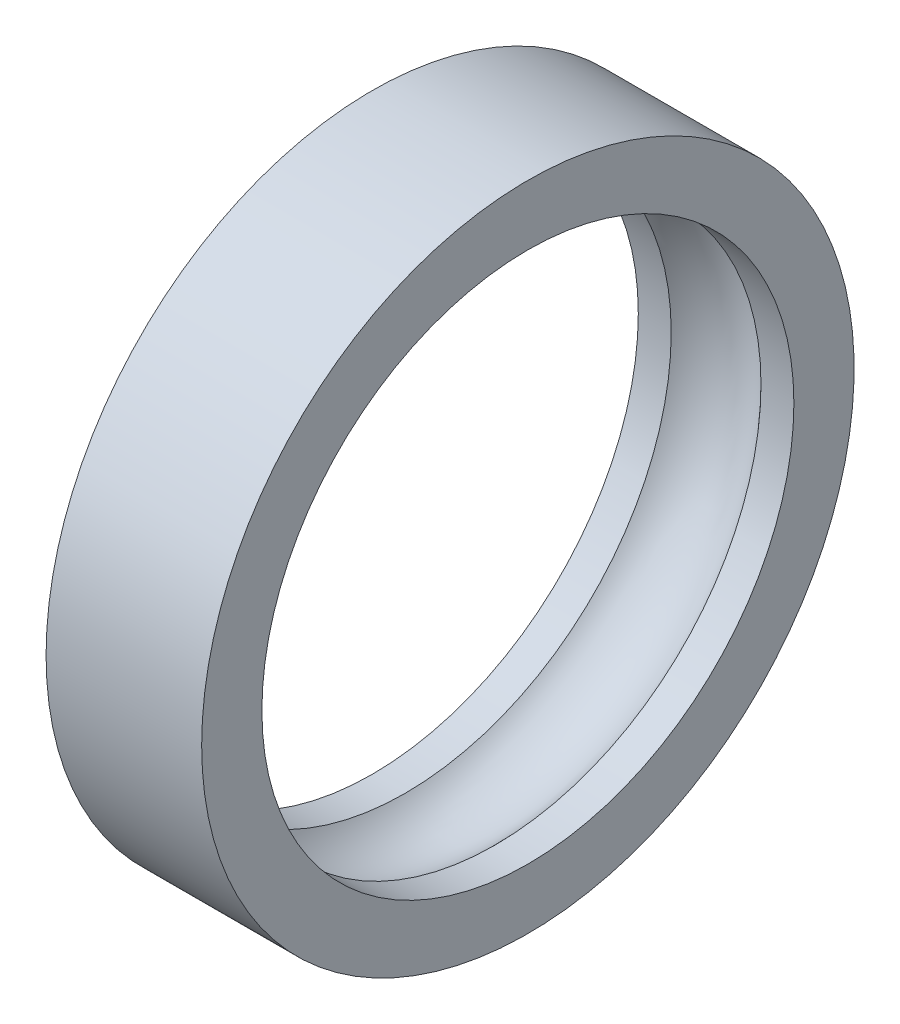
ISO-10303-21;
HEADER;
FILE_DESCRIPTION(('STEP AP214'),'2;1');
FILE_NAME('part.step','',(''),(''),'','','');
FILE_SCHEMA(('AUTOMOTIVE_DESIGN { 1 0 10303 214 1 1 1 1 }'));
ENDSEC;
DATA;
#1=APPLICATION_CONTEXT('core data for automotive mechanical design processes');
#2=APPLICATION_PROTOCOL_DEFINITION('international standard','automotive_design',2000,#1);
#3=PRODUCT_CONTEXT('',#1,'mechanical');
#4=PRODUCT('Part','Part','',(#3));
#5=PRODUCT_RELATED_PRODUCT_CATEGORY('part','',(#4));
#6=PRODUCT_DEFINITION_FORMATION('','',#4);
#7=PRODUCT_DEFINITION_CONTEXT('part definition',#1,'design');
#8=PRODUCT_DEFINITION('design','',#6,#7);
#9=PRODUCT_DEFINITION_SHAPE('','',#8);
#10=(LENGTH_UNIT() NAMED_UNIT(*) SI_UNIT(.MILLI.,.METRE.));
#11=(NAMED_UNIT(*) PLANE_ANGLE_UNIT() SI_UNIT($,.RADIAN.));
#12=(NAMED_UNIT(*) SI_UNIT($,.STERADIAN.) SOLID_ANGLE_UNIT());
#13=UNCERTAINTY_MEASURE_WITH_UNIT(LENGTH_MEASURE(1.E-05),#10,'distance_accuracy_value','');
#14=(GEOMETRIC_REPRESENTATION_CONTEXT(3) GLOBAL_UNCERTAINTY_ASSIGNED_CONTEXT((#13)) GLOBAL_UNIT_ASSIGNED_CONTEXT((#10,
#11,#12)) REPRESENTATION_CONTEXT('',''));
#15=CARTESIAN_POINT('',(0.,0.,0.));
#16=DIRECTION('',(0.,0.,1.));
#17=DIRECTION('',(1.,0.,0.));
#18=AXIS2_PLACEMENT_3D('',#15,#16,#17);
#19=CARTESIAN_POINT('',(-15.5,53.,0.));
#20=DIRECTION('',(1.,0.,0.));
#21=DIRECTION('',(0.,0.,-1.));
#22=AXIS2_PLACEMENT_3D('',#19,#20,#21);
#23=PLANE('',#22);
#24=CARTESIAN_POINT('',(-15.5,0.,0.));
#25=DIRECTION('',(-1.,0.,0.));
#26=DIRECTION('',(0.,0.,1.));
#27=AXIS2_PLACEMENT_3D('',#24,#25,#26);
#28=CIRCLE('',#27,53.);
#29=CARTESIAN_POINT('',(-15.5,0.,53.));
#30=VERTEX_POINT('',#29);
#31=EDGE_CURVE('E53',#30,#30,#28,.T.);
#32=ORIENTED_EDGE('',*,*,#31,.F.);
#33=EDGE_LOOP('',(#32));
#34=FACE_BOUND('',#33,.T.);
#35=CARTESIAN_POINT('',(-15.5,0.,0.));
#36=DIRECTION('',(-1.,0.,0.));
#37=DIRECTION('',(0.,0.,1.));
#38=AXIS2_PLACEMENT_3D('',#35,#36,#37);
#39=CIRCLE('',#38,65.);
#40=CARTESIAN_POINT('',(-15.5,0.,65.));
#41=VERTEX_POINT('',#40);
#42=EDGE_CURVE('E10',#41,#41,#39,.T.);
#43=ORIENTED_EDGE('',*,*,#42,.T.);
#44=EDGE_LOOP('',(#43));
#45=FACE_BOUND('',#44,.T.);
#46=ADVANCED_FACE('F31',(#34,#45),#23,.F.);
#47=CARTESIAN_POINT('',(-15.5,0.,0.));
#48=DIRECTION('',(-1.,0.,0.));
#49=DIRECTION('',(0.,0.,1.));
#50=AXIS2_PLACEMENT_3D('',#47,#48,#49);
#51=CYLINDRICAL_SURFACE('',#50,65.);
#52=ORIENTED_EDGE('',*,*,#42,.F.);
#53=EDGE_LOOP('',(#52));
#54=FACE_BOUND('',#53,.T.);
#55=CARTESIAN_POINT('',(15.5,0.,0.));
#56=DIRECTION('',(-1.,0.,0.));
#57=DIRECTION('',(0.,0.,1.));
#58=AXIS2_PLACEMENT_3D('',#55,#56,#57);
#59=CIRCLE('',#58,65.);
#60=CARTESIAN_POINT('',(15.5,0.,65.));
#61=VERTEX_POINT('',#60);
#62=EDGE_CURVE('E37',#61,#61,#59,.T.);
#63=ORIENTED_EDGE('',*,*,#62,.T.);
#64=EDGE_LOOP('',(#63));
#65=FACE_BOUND('',#64,.T.);
#66=ADVANCED_FACE('F60',(#54,#65),#51,.T.);
#67=CARTESIAN_POINT('',(15.5,53.,0.));
#68=DIRECTION('',(-1.,0.,0.));
#69=DIRECTION('',(0.,0.,1.));
#70=AXIS2_PLACEMENT_3D('',#67,#68,#69);
#71=PLANE('',#70);
#72=ORIENTED_EDGE('',*,*,#62,.F.);
#73=EDGE_LOOP('',(#72));
#74=FACE_BOUND('',#73,.T.);
#75=CARTESIAN_POINT('',(15.5,0.,0.));
#76=DIRECTION('',(-1.,0.,0.));
#77=DIRECTION('',(0.,0.,1.));
#78=AXIS2_PLACEMENT_3D('',#75,#76,#77);
#79=CIRCLE('',#78,53.);
#80=CARTESIAN_POINT('',(15.5,0.,53.));
#81=VERTEX_POINT('',#80);
#82=EDGE_CURVE('E41',#81,#81,#79,.T.);
#83=ORIENTED_EDGE('',*,*,#82,.T.);
#84=EDGE_LOOP('',(#83));
#85=FACE_BOUND('',#84,.T.);
#86=ADVANCED_FACE('F64',(#74,#85),#71,.F.);
#87=CARTESIAN_POINT('',(-15.5,0.,0.));
#88=DIRECTION('',(-1.,0.,0.));
#89=DIRECTION('',(0.,0.,1.));
#90=AXIS2_PLACEMENT_3D('',#87,#88,#89);
#91=CYLINDRICAL_SURFACE('',#90,53.);
#92=ORIENTED_EDGE('',*,*,#82,.F.);
#93=EDGE_LOOP('',(#92));
#94=FACE_BOUND('',#93,.T.);
#95=CARTESIAN_POINT('',(8.94427190999916,0.,0.));
#96=DIRECTION('',(-1.,0.,0.));
#97=DIRECTION('',(0.,0.,1.));
#98=AXIS2_PLACEMENT_3D('',#95,#96,#97);
#99=CIRCLE('',#98,53.);
#100=CARTESIAN_POINT('',(8.94427190999916,0.,53.));
#101=VERTEX_POINT('',#100);
#102=EDGE_CURVE('E45',#101,#101,#99,.T.);
#103=ORIENTED_EDGE('',*,*,#102,.T.);
#104=EDGE_LOOP('',(#103));
#105=FACE_BOUND('',#104,.T.);
#106=ADVANCED_FACE('F69',(#94,#105),#91,.F.);
#107=CARTESIAN_POINT('',(0.,0.,0.));
#108=DIRECTION('',(-1.,0.,0.));
#109=DIRECTION('',(0.,0.,1.));
#110=AXIS2_PLACEMENT_3D('',#107,#108,#109);
#111=TOROIDAL_SURFACE('',#110,45.,12.);
#112=ORIENTED_EDGE('',*,*,#102,.F.);
#113=EDGE_LOOP('',(#112));
#114=FACE_BOUND('',#113,.T.);
#115=CARTESIAN_POINT('',(-8.94427190999915,0.,0.));
#116=DIRECTION('',(-1.,0.,0.));
#117=DIRECTION('',(0.,0.,1.));
#118=AXIS2_PLACEMENT_3D('',#115,#116,#117);
#119=CIRCLE('',#118,53.);
#120=CARTESIAN_POINT('',(-8.94427190999915,0.,53.));
#121=VERTEX_POINT('',#120);
#122=EDGE_CURVE('E50',#121,#121,#119,.T.);
#123=ORIENTED_EDGE('',*,*,#122,.T.);
#124=EDGE_LOOP('',(#123));
#125=FACE_BOUND('',#124,.T.);
#126=ADVANCED_FACE('F75',(#114,#125),#111,.F.);
#127=CARTESIAN_POINT('',(-15.5,0.,0.));
#128=DIRECTION('',(-1.,0.,0.));
#129=DIRECTION('',(0.,0.,1.));
#130=AXIS2_PLACEMENT_3D('',#127,#128,#129);
#131=CYLINDRICAL_SURFACE('',#130,53.);
#132=ORIENTED_EDGE('',*,*,#122,.F.);
#133=EDGE_LOOP('',(#132));
#134=FACE_BOUND('',#133,.T.);
#135=ORIENTED_EDGE('',*,*,#31,.T.);
#136=EDGE_LOOP('',(#135));
#137=FACE_BOUND('',#136,.T.);
#138=ADVANCED_FACE('F57',(#134,#137),#131,.F.);
#139=CLOSED_SHELL('',(#46,#66,#86,#106,#126,#138));
#140=MANIFOLD_SOLID_BREP('B2',#139);
#141=ADVANCED_BREP_SHAPE_REPRESENTATION('',(#18,#140),#14);
#142=SHAPE_DEFINITION_REPRESENTATION(#9,#141);
ENDSEC;
END-ISO-10303-21;
